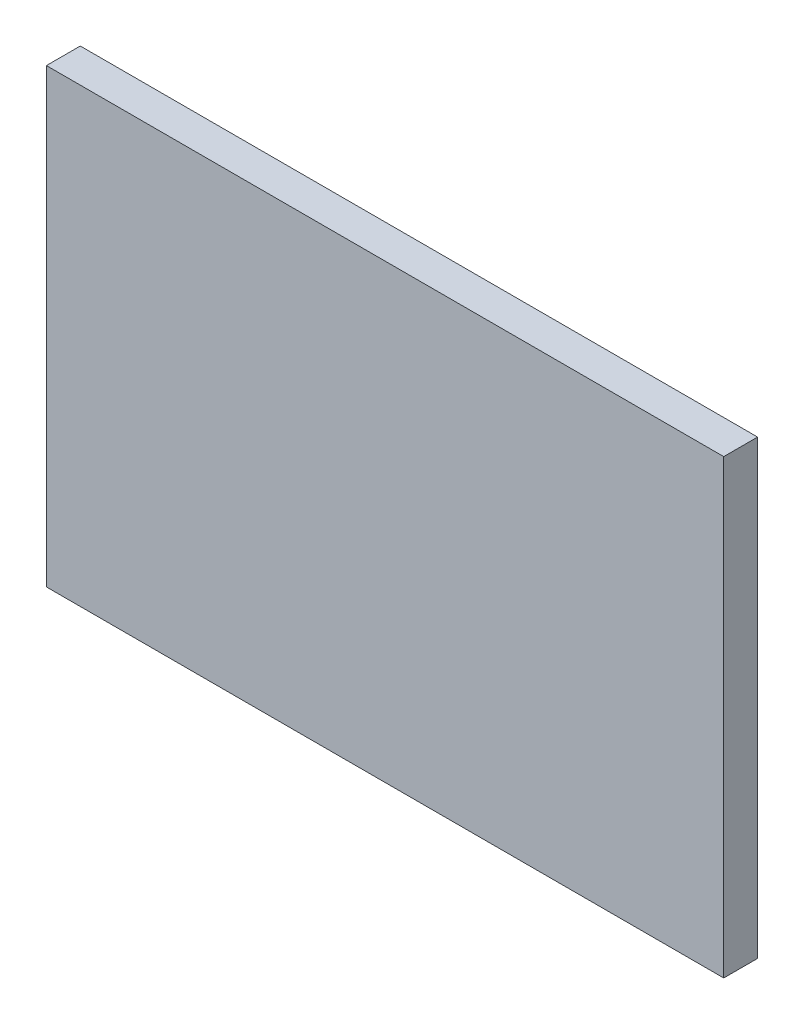
ISO-10303-21;
HEADER;
FILE_DESCRIPTION(('STEP AP214'),'2;1');
FILE_NAME('part.step','',(''),(''),'','','');
FILE_SCHEMA(('AUTOMOTIVE_DESIGN { 1 0 10303 214 1 1 1 1 }'));
ENDSEC;
DATA;
#1=APPLICATION_CONTEXT('core data for automotive mechanical design processes');
#2=APPLICATION_PROTOCOL_DEFINITION('international standard','automotive_design',2000,#1);
#3=PRODUCT_CONTEXT('',#1,'mechanical');
#4=PRODUCT('Part','Part','',(#3));
#5=PRODUCT_RELATED_PRODUCT_CATEGORY('part','',(#4));
#6=PRODUCT_DEFINITION_FORMATION('','',#4);
#7=PRODUCT_DEFINITION_CONTEXT('part definition',#1,'design');
#8=PRODUCT_DEFINITION('design','',#6,#7);
#9=PRODUCT_DEFINITION_SHAPE('','',#8);
#10=(LENGTH_UNIT() NAMED_UNIT(*) SI_UNIT(.MILLI.,.METRE.));
#11=(NAMED_UNIT(*) PLANE_ANGLE_UNIT() SI_UNIT($,.RADIAN.));
#12=(NAMED_UNIT(*) SI_UNIT($,.STERADIAN.) SOLID_ANGLE_UNIT());
#13=UNCERTAINTY_MEASURE_WITH_UNIT(LENGTH_MEASURE(1.E-05),#10,'distance_accuracy_value','');
#14=(GEOMETRIC_REPRESENTATION_CONTEXT(3) GLOBAL_UNCERTAINTY_ASSIGNED_CONTEXT((#13)) GLOBAL_UNIT_ASSIGNED_CONTEXT((#10,
#11,#12)) REPRESENTATION_CONTEXT('',''));
#15=CARTESIAN_POINT('',(0.,0.,0.));
#16=DIRECTION('',(0.,0.,1.));
#17=DIRECTION('',(1.,0.,0.));
#18=AXIS2_PLACEMENT_3D('',#15,#16,#17);
#19=CARTESIAN_POINT('',(-112.872937734929,69.0298507462687,7.5));
#20=DIRECTION('',(1.,0.,0.));
#21=DIRECTION('',(0.,0.,-1.));
#22=AXIS2_PLACEMENT_3D('',#19,#20,#21);
#23=PLANE('',#22);
#24=DIRECTION('',(0.,-1.,0.));
#25=VECTOR('',#24,1.);
#26=CARTESIAN_POINT('',(-112.872937734929,69.0298507462687,0.));
#27=LINE('',#26,#25);
#28=CARTESIAN_POINT('',(-112.872937734929,69.0298507462687,0.));
#29=VERTEX_POINT('',#28);
#30=CARTESIAN_POINT('',(-112.872937734929,-30.9701492537313,0.));
#31=VERTEX_POINT('',#30);
#32=EDGE_CURVE('E111',#29,#31,#27,.T.);
#33=ORIENTED_EDGE('',*,*,#32,.T.);
#34=DIRECTION('',(0.,0.,-1.));
#35=VECTOR('',#34,1.);
#36=CARTESIAN_POINT('',(-112.872937734929,-30.9701492537313,7.5));
#37=LINE('',#36,#35);
#38=CARTESIAN_POINT('',(-112.872937734929,-30.9701492537313,7.5));
#39=VERTEX_POINT('',#38);
#40=EDGE_CURVE('E11',#39,#31,#37,.T.);
#41=ORIENTED_EDGE('',*,*,#40,.F.);
#42=DIRECTION('',(0.,-1.,0.));
#43=VECTOR('',#42,1.);
#44=CARTESIAN_POINT('',(-112.872937734929,69.0298507462687,7.5));
#45=LINE('',#44,#43);
#46=CARTESIAN_POINT('',(-112.872937734929,69.0298507462687,7.5));
#47=VERTEX_POINT('',#46);
#48=EDGE_CURVE('E95',#47,#39,#45,.T.);
#49=ORIENTED_EDGE('',*,*,#48,.F.);
#50=DIRECTION('',(0.,0.,-1.));
#51=VECTOR('',#50,1.);
#52=CARTESIAN_POINT('',(-112.872937734929,69.0298507462687,7.5));
#53=LINE('',#52,#51);
#54=EDGE_CURVE('E107',#47,#29,#53,.T.);
#55=ORIENTED_EDGE('',*,*,#54,.T.);
#56=EDGE_LOOP('',(#33,#41,#49,#55));
#57=FACE_BOUND('',#56,.T.);
#58=ADVANCED_FACE('F43',(#57),#23,.F.);
#59=CARTESIAN_POINT('',(-112.872937734929,-30.9701492537313,7.5));
#60=DIRECTION('',(0.,1.,0.));
#61=DIRECTION('',(-1.,0.,0.));
#62=AXIS2_PLACEMENT_3D('',#59,#60,#61);
#63=PLANE('',#62);
#64=DIRECTION('',(1.,0.,0.));
#65=VECTOR('',#64,1.);
#66=CARTESIAN_POINT('',(-112.872937734929,-30.9701492537313,0.));
#67=LINE('',#66,#65);
#68=CARTESIAN_POINT('',(37.1270622650708,-30.9701492537313,0.));
#69=VERTEX_POINT('',#68);
#70=EDGE_CURVE('E100',#31,#69,#67,.T.);
#71=ORIENTED_EDGE('',*,*,#70,.T.);
#72=DIRECTION('',(0.,0.,-1.));
#73=VECTOR('',#72,1.);
#74=CARTESIAN_POINT('',(37.1270622650708,-30.9701492537313,7.5));
#75=LINE('',#74,#73);
#76=CARTESIAN_POINT('',(37.1270622650708,-30.9701492537313,7.5));
#77=VERTEX_POINT('',#76);
#78=EDGE_CURVE('E52',#77,#69,#75,.T.);
#79=ORIENTED_EDGE('',*,*,#78,.F.);
#80=DIRECTION('',(1.,0.,0.));
#81=VECTOR('',#80,1.);
#82=CARTESIAN_POINT('',(-112.872937734929,-30.9701492537313,7.5));
#83=LINE('',#82,#81);
#84=EDGE_CURVE('E90',#39,#77,#83,.T.);
#85=ORIENTED_EDGE('',*,*,#84,.F.);
#86=ORIENTED_EDGE('',*,*,#40,.T.);
#87=EDGE_LOOP('',(#71,#79,#85,#86));
#88=FACE_BOUND('',#87,.T.);
#89=ADVANCED_FACE('F99',(#88),#63,.F.);
#90=CARTESIAN_POINT('',(37.1270622650708,69.0298507462687,7.5));
#91=DIRECTION('',(-1.,0.,0.));
#92=DIRECTION('',(0.,-1.,0.));
#93=AXIS2_PLACEMENT_3D('',#90,#91,#92);
#94=PLANE('',#93);
#95=DIRECTION('',(0.,1.,0.));
#96=VECTOR('',#95,1.);
#97=CARTESIAN_POINT('',(37.1270622650708,69.0298507462687,0.));
#98=LINE('',#97,#96);
#99=CARTESIAN_POINT('',(37.1270622650708,69.0298507462687,0.));
#100=VERTEX_POINT('',#99);
#101=EDGE_CURVE('E77',#69,#100,#98,.T.);
#102=ORIENTED_EDGE('',*,*,#101,.T.);
#103=DIRECTION('',(0.,0.,-1.));
#104=VECTOR('',#103,1.);
#105=CARTESIAN_POINT('',(37.1270622650708,69.0298507462687,7.5));
#106=LINE('',#105,#104);
#107=CARTESIAN_POINT('',(37.1270622650708,69.0298507462687,7.5));
#108=VERTEX_POINT('',#107);
#109=EDGE_CURVE('E102',#108,#100,#106,.T.);
#110=ORIENTED_EDGE('',*,*,#109,.F.);
#111=DIRECTION('',(0.,1.,0.));
#112=VECTOR('',#111,1.);
#113=CARTESIAN_POINT('',(37.1270622650708,69.0298507462687,7.5));
#114=LINE('',#113,#112);
#115=EDGE_CURVE('E93',#77,#108,#114,.T.);
#116=ORIENTED_EDGE('',*,*,#115,.F.);
#117=ORIENTED_EDGE('',*,*,#78,.T.);
#118=EDGE_LOOP('',(#102,#110,#116,#117));
#119=FACE_BOUND('',#118,.T.);
#120=ADVANCED_FACE('F103',(#119),#94,.F.);
#121=CARTESIAN_POINT('',(-112.872937734929,69.0298507462687,7.5));
#122=DIRECTION('',(0.,-1.,0.));
#123=DIRECTION('',(0.,0.,-1.));
#124=AXIS2_PLACEMENT_3D('',#121,#122,#123);
#125=PLANE('',#124);
#126=DIRECTION('',(-1.,0.,0.));
#127=VECTOR('',#126,1.);
#128=CARTESIAN_POINT('',(-112.872937734929,69.0298507462687,0.));
#129=LINE('',#128,#127);
#130=EDGE_CURVE('E83',#100,#29,#129,.T.);
#131=ORIENTED_EDGE('',*,*,#130,.T.);
#132=ORIENTED_EDGE('',*,*,#54,.F.);
#133=DIRECTION('',(-1.,0.,0.));
#134=VECTOR('',#133,1.);
#135=CARTESIAN_POINT('',(-112.872937734929,69.0298507462687,7.5));
#136=LINE('',#135,#134);
#137=EDGE_CURVE('E60',#108,#47,#136,.T.);
#138=ORIENTED_EDGE('',*,*,#137,.F.);
#139=ORIENTED_EDGE('',*,*,#109,.T.);
#140=EDGE_LOOP('',(#131,#132,#138,#139));
#141=FACE_BOUND('',#140,.T.);
#142=ADVANCED_FACE('F124',(#141),#125,.F.);
#143=CARTESIAN_POINT('',(0.,0.,7.5));
#144=DIRECTION('',(0.,0.,1.));
#145=DIRECTION('',(1.,0.,0.));
#146=AXIS2_PLACEMENT_3D('',#143,#144,#145);
#147=PLANE('',#146);
#148=ORIENTED_EDGE('',*,*,#48,.T.);
#149=ORIENTED_EDGE('',*,*,#84,.T.);
#150=ORIENTED_EDGE('',*,*,#115,.T.);
#151=ORIENTED_EDGE('',*,*,#137,.T.);
#152=EDGE_LOOP('',(#148,#149,#150,#151));
#153=FACE_BOUND('',#152,.T.);
#154=ADVANCED_FACE('F91',(#153),#147,.T.);
#155=CARTESIAN_POINT('',(0.,0.,0.));
#156=DIRECTION('',(0.,0.,1.));
#157=DIRECTION('',(1.,0.,0.));
#158=AXIS2_PLACEMENT_3D('',#155,#156,#157);
#159=PLANE('',#158);
#160=ORIENTED_EDGE('',*,*,#32,.F.);
#161=ORIENTED_EDGE('',*,*,#130,.F.);
#162=ORIENTED_EDGE('',*,*,#101,.F.);
#163=ORIENTED_EDGE('',*,*,#70,.F.);
#164=EDGE_LOOP('',(#160,#161,#162,#163));
#165=FACE_BOUND('',#164,.T.);
#166=ADVANCED_FACE('F127',(#165),#159,.F.);
#167=CLOSED_SHELL('',(#58,#89,#120,#142,#154,#166));
#168=MANIFOLD_SOLID_BREP('B2',#167);
#169=ADVANCED_BREP_SHAPE_REPRESENTATION('',(#18,#168),#14);
#170=SHAPE_DEFINITION_REPRESENTATION(#9,#169);
ENDSEC;
END-ISO-10303-21;
